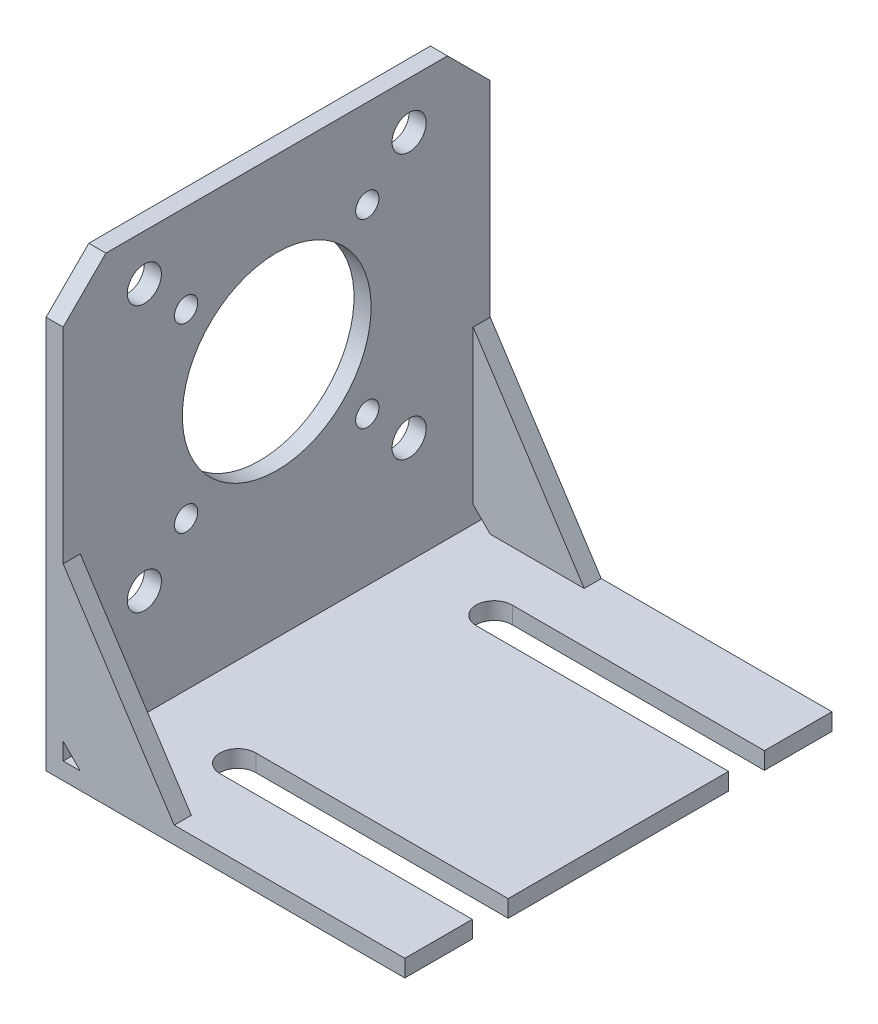
ISO-10303-21;
HEADER;
FILE_DESCRIPTION(('STEP AP214'),'2;1');
FILE_NAME('part.step','',(''),(''),'','','');
FILE_SCHEMA(('AUTOMOTIVE_DESIGN { 1 0 10303 214 1 1 1 1 }'));
ENDSEC;
DATA;
#1=APPLICATION_CONTEXT('core data for automotive mechanical design processes');
#2=APPLICATION_PROTOCOL_DEFINITION('international standard','automotive_design',2000,#1);
#3=PRODUCT_CONTEXT('',#1,'mechanical');
#4=PRODUCT('Part','Part','',(#3));
#5=PRODUCT_RELATED_PRODUCT_CATEGORY('part','',(#4));
#6=PRODUCT_DEFINITION_FORMATION('','',#4);
#7=PRODUCT_DEFINITION_CONTEXT('part definition',#1,'design');
#8=PRODUCT_DEFINITION('design','',#6,#7);
#9=PRODUCT_DEFINITION_SHAPE('','',#8);
#10=(LENGTH_UNIT() NAMED_UNIT(*) SI_UNIT(.MILLI.,.METRE.));
#11=(NAMED_UNIT(*) PLANE_ANGLE_UNIT() SI_UNIT($,.RADIAN.));
#12=(NAMED_UNIT(*) SI_UNIT($,.STERADIAN.) SOLID_ANGLE_UNIT());
#13=UNCERTAINTY_MEASURE_WITH_UNIT(LENGTH_MEASURE(1.E-05),#10,'distance_accuracy_value','');
#14=(GEOMETRIC_REPRESENTATION_CONTEXT(3) GLOBAL_UNCERTAINTY_ASSIGNED_CONTEXT((#13)) GLOBAL_UNIT_ASSIGNED_CONTEXT((#10,
#11,#12)) REPRESENTATION_CONTEXT('',''));
#15=CARTESIAN_POINT('',(0.,0.,0.));
#16=DIRECTION('',(0.,0.,1.));
#17=DIRECTION('',(1.,0.,0.));
#18=AXIS2_PLACEMENT_3D('',#15,#16,#17);
#19=CARTESIAN_POINT('',(53.,0.,50.));
#20=DIRECTION('',(0.,1.,0.));
#21=DIRECTION('',(-1.,0.,0.));
#22=AXIS2_PLACEMENT_3D('',#19,#20,#21);
#23=PLANE('',#22);
#24=DIRECTION('',(1.,0.,0.));
#25=VECTOR('',#24,1.);
#26=CARTESIAN_POINT('',(53.,0.,0.));
#27=LINE('',#26,#25);
#28=CARTESIAN_POINT('',(0.,0.,0.));
#29=VERTEX_POINT('',#28);
#30=CARTESIAN_POINT('',(42.,0.,0.));
#31=VERTEX_POINT('',#30);
#32=EDGE_CURVE('E235',#29,#31,#27,.T.);
#33=ORIENTED_EDGE('',*,*,#32,.T.);
#34=DIRECTION('',(0.,0.,1.));
#35=VECTOR('',#34,1.);
#36=CARTESIAN_POINT('',(42.,0.,50.));
#37=LINE('',#36,#35);
#38=CARTESIAN_POINT('',(42.,0.,7.90047683310867));
#39=VERTEX_POINT('',#38);
#40=EDGE_CURVE('E201',#31,#39,#37,.T.);
#41=ORIENTED_EDGE('',*,*,#40,.T.);
#42=DIRECTION('',(-1.,0.,0.));
#43=VECTOR('',#42,1.);
#44=CARTESIAN_POINT('',(53.,0.,7.90047683310866));
#45=LINE('',#44,#43);
#46=CARTESIAN_POINT('',(12.5,0.,7.90047683310867));
#47=VERTEX_POINT('',#46);
#48=EDGE_CURVE('E507',#39,#47,#45,.T.);
#49=ORIENTED_EDGE('',*,*,#48,.T.);
#50=CARTESIAN_POINT('',(12.4552510146861,0.,10.));
#51=DIRECTION('',(0.,1.,0.));
#52=DIRECTION('',(-1.,0.,0.));
#53=AXIS2_PLACEMENT_3D('',#50,#51,#52);
#54=CIRCLE('',#53,2.1);
#55=CARTESIAN_POINT('',(12.4552510146865,0.,12.1));
#56=VERTEX_POINT('',#55);
#57=EDGE_CURVE('E513',#47,#56,#54,.T.);
#58=ORIENTED_EDGE('',*,*,#57,.T.);
#59=DIRECTION('',(1.,0.,0.));
#60=VECTOR('',#59,1.);
#61=CARTESIAN_POINT('',(53.,0.,12.1));
#62=LINE('',#61,#60);
#63=CARTESIAN_POINT('',(42.,0.,12.1));
#64=VERTEX_POINT('',#63);
#65=EDGE_CURVE('E517',#56,#64,#62,.T.);
#66=ORIENTED_EDGE('',*,*,#65,.T.);
#67=CARTESIAN_POINT('',(42.,0.,37.9));
#68=VERTEX_POINT('',#67);
#69=EDGE_CURVE('E353',#64,#68,#37,.T.);
#70=ORIENTED_EDGE('',*,*,#69,.T.);
#71=DIRECTION('',(-1.,0.,0.));
#72=VECTOR('',#71,1.);
#73=CARTESIAN_POINT('',(53.,0.,37.9));
#74=LINE('',#73,#72);
#75=CARTESIAN_POINT('',(12.4552510146865,0.,37.9));
#76=VERTEX_POINT('',#75);
#77=EDGE_CURVE('E482',#68,#76,#74,.T.);
#78=ORIENTED_EDGE('',*,*,#77,.T.);
#79=CARTESIAN_POINT('',(12.4552510146873,0.,40.));
#80=DIRECTION('',(0.,1.,0.));
#81=DIRECTION('',(-1.,0.,0.));
#82=AXIS2_PLACEMENT_3D('',#79,#80,#81);
#83=CIRCLE('',#82,2.09999999999999);
#84=CARTESIAN_POINT('',(12.5,0.,42.0995231668913));
#85=VERTEX_POINT('',#84);
#86=EDGE_CURVE('E488',#76,#85,#83,.T.);
#87=ORIENTED_EDGE('',*,*,#86,.T.);
#88=DIRECTION('',(1.,0.,0.));
#89=VECTOR('',#88,1.);
#90=CARTESIAN_POINT('',(53.,0.,42.0995231668913));
#91=LINE('',#90,#89);
#92=CARTESIAN_POINT('',(42.,0.,42.0995231668913));
#93=VERTEX_POINT('',#92);
#94=EDGE_CURVE('E348',#85,#93,#91,.T.);
#95=ORIENTED_EDGE('',*,*,#94,.T.);
#96=CARTESIAN_POINT('',(42.,0.,50.));
#97=VERTEX_POINT('',#96);
#98=EDGE_CURVE('E62',#93,#97,#37,.T.);
#99=ORIENTED_EDGE('',*,*,#98,.T.);
#100=DIRECTION('',(1.,0.,0.));
#101=VECTOR('',#100,1.);
#102=CARTESIAN_POINT('',(53.,0.,50.));
#103=LINE('',#102,#101);
#104=CARTESIAN_POINT('',(0.,0.,50.));
#105=VERTEX_POINT('',#104);
#106=EDGE_CURVE('E243',#105,#97,#103,.T.);
#107=ORIENTED_EDGE('',*,*,#106,.F.);
#108=DIRECTION('',(0.,0.,-1.));
#109=VECTOR('',#108,1.);
#110=CARTESIAN_POINT('',(0.,0.,50.));
#111=LINE('',#110,#109);
#112=EDGE_CURVE('E244',#105,#29,#111,.T.);
#113=ORIENTED_EDGE('',*,*,#112,.T.);
#114=EDGE_LOOP('',(#33,#41,#49,#58,#66,#70,#78,#87,#95,#99,#107,#113));
#115=FACE_BOUND('',#114,.T.);
#116=ADVANCED_FACE('F38',(#115),#23,.F.);
#117=CARTESIAN_POINT('',(1.99999999999999,2.,50.));
#118=DIRECTION('',(0.,-1.,0.));
#119=DIRECTION('',(0.,0.,-1.));
#120=AXIS2_PLACEMENT_3D('',#117,#118,#119);
#121=PLANE('',#120);
#122=DIRECTION('',(-1.,0.,0.));
#123=VECTOR('',#122,1.);
#124=CARTESIAN_POINT('',(1.99999999999999,2.,50.));
#125=LINE('',#124,#123);
#126=CARTESIAN_POINT('',(42.,2.,50.));
#127=VERTEX_POINT('',#126);
#128=CARTESIAN_POINT('',(15.,2.,50.));
#129=VERTEX_POINT('',#128);
#130=EDGE_CURVE('E306',#127,#129,#125,.T.);
#131=ORIENTED_EDGE('',*,*,#130,.F.);
#132=DIRECTION('',(0.,0.,1.));
#133=VECTOR('',#132,1.);
#134=CARTESIAN_POINT('',(42.,2.,50.));
#135=LINE('',#134,#133);
#136=CARTESIAN_POINT('',(42.,2.,42.0995231668913));
#137=VERTEX_POINT('',#136);
#138=EDGE_CURVE('E220',#137,#127,#135,.T.);
#139=ORIENTED_EDGE('',*,*,#138,.F.);
#140=DIRECTION('',(1.,0.,0.));
#141=VECTOR('',#140,1.);
#142=CARTESIAN_POINT('',(12.5,2.,42.0995231668913));
#143=LINE('',#142,#141);
#144=CARTESIAN_POINT('',(12.5,2.,42.0995231668913));
#145=VERTEX_POINT('',#144);
#146=EDGE_CURVE('E474',#145,#137,#143,.T.);
#147=ORIENTED_EDGE('',*,*,#146,.F.);
#148=CARTESIAN_POINT('',(12.4552510146873,2.,40.));
#149=DIRECTION('',(0.,1.,0.));
#150=DIRECTION('',(0.,0.,-1.));
#151=AXIS2_PLACEMENT_3D('',#148,#149,#150);
#152=CIRCLE('',#151,2.09999999999999);
#153=CARTESIAN_POINT('',(12.4552510146865,2.,37.9));
#154=VERTEX_POINT('',#153);
#155=EDGE_CURVE('E470',#154,#145,#152,.T.);
#156=ORIENTED_EDGE('',*,*,#155,.F.);
#157=DIRECTION('',(-1.,0.,0.));
#158=VECTOR('',#157,1.);
#159=CARTESIAN_POINT('',(12.4552510146865,2.,37.9));
#160=LINE('',#159,#158);
#161=CARTESIAN_POINT('',(42.,2.,37.9));
#162=VERTEX_POINT('',#161);
#163=EDGE_CURVE('E457',#162,#154,#160,.T.);
#164=ORIENTED_EDGE('',*,*,#163,.F.);
#165=CARTESIAN_POINT('',(42.,2.,12.1));
#166=VERTEX_POINT('',#165);
#167=EDGE_CURVE('E218',#166,#162,#135,.T.);
#168=ORIENTED_EDGE('',*,*,#167,.F.);
#169=DIRECTION('',(1.,0.,0.));
#170=VECTOR('',#169,1.);
#171=CARTESIAN_POINT('',(12.4552510146865,2.,12.1));
#172=LINE('',#171,#170);
#173=CARTESIAN_POINT('',(12.4552510146865,2.,12.1));
#174=VERTEX_POINT('',#173);
#175=EDGE_CURVE('E499',#174,#166,#172,.T.);
#176=ORIENTED_EDGE('',*,*,#175,.F.);
#177=CARTESIAN_POINT('',(12.4552510146861,2.,10.));
#178=DIRECTION('',(0.,1.,0.));
#179=DIRECTION('',(0.,0.,-1.));
#180=AXIS2_PLACEMENT_3D('',#177,#178,#179);
#181=CIRCLE('',#180,2.1);
#182=CARTESIAN_POINT('',(12.5,2.,7.90047683310867));
#183=VERTEX_POINT('',#182);
#184=EDGE_CURVE('E495',#183,#174,#181,.T.);
#185=ORIENTED_EDGE('',*,*,#184,.F.);
#186=DIRECTION('',(-1.,0.,0.));
#187=VECTOR('',#186,1.);
#188=CARTESIAN_POINT('',(12.5,2.,7.90047683310867));
#189=LINE('',#188,#187);
#190=CARTESIAN_POINT('',(42.,2.,7.90047683310867));
#191=VERTEX_POINT('',#190);
#192=EDGE_CURVE('E216',#191,#183,#189,.T.);
#193=ORIENTED_EDGE('',*,*,#192,.F.);
#194=CARTESIAN_POINT('',(42.,2.,0.));
#195=VERTEX_POINT('',#194);
#196=EDGE_CURVE('E54',#195,#191,#135,.T.);
#197=ORIENTED_EDGE('',*,*,#196,.F.);
#198=DIRECTION('',(-1.,0.,0.));
#199=VECTOR('',#198,1.);
#200=CARTESIAN_POINT('',(1.99999999999999,2.,0.));
#201=LINE('',#200,#199);
#202=CARTESIAN_POINT('',(15.,2.,0.));
#203=VERTEX_POINT('',#202);
#204=EDGE_CURVE('E213',#195,#203,#201,.T.);
#205=ORIENTED_EDGE('',*,*,#204,.T.);
#206=DIRECTION('',(0.,0.,-1.));
#207=VECTOR('',#206,1.);
#208=CARTESIAN_POINT('',(15.,2.,2.));
#209=LINE('',#208,#207);
#210=CARTESIAN_POINT('',(15.,2.,2.));
#211=VERTEX_POINT('',#210);
#212=EDGE_CURVE('E418',#211,#203,#209,.T.);
#213=ORIENTED_EDGE('',*,*,#212,.F.);
#214=DIRECTION('',(-1.,0.,0.));
#215=VECTOR('',#214,1.);
#216=CARTESIAN_POINT('',(15.,2.,2.));
#217=LINE('',#216,#215);
#218=CARTESIAN_POINT('',(3.99999999999999,2.,2.));
#219=VERTEX_POINT('',#218);
#220=EDGE_CURVE('E398',#211,#219,#217,.T.);
#221=ORIENTED_EDGE('',*,*,#220,.T.);
#222=DIRECTION('',(0.,0.,-1.));
#223=VECTOR('',#222,1.);
#224=CARTESIAN_POINT('',(3.99999999999999,2.,2.));
#225=LINE('',#224,#223);
#226=CARTESIAN_POINT('',(3.99999999999999,2.,0.));
#227=VERTEX_POINT('',#226);
#228=EDGE_CURVE('E412',#219,#227,#225,.T.);
#229=ORIENTED_EDGE('',*,*,#228,.T.);
#230=CARTESIAN_POINT('',(1.99999999999999,2.,0.));
#231=VERTEX_POINT('',#230);
#232=EDGE_CURVE('E228',#227,#231,#201,.T.);
#233=ORIENTED_EDGE('',*,*,#232,.T.);
#234=DIRECTION('',(0.,0.,-1.));
#235=VECTOR('',#234,1.);
#236=CARTESIAN_POINT('',(1.99999999999999,2.,50.));
#237=LINE('',#236,#235);
#238=CARTESIAN_POINT('',(1.99999999999999,2.,50.));
#239=VERTEX_POINT('',#238);
#240=EDGE_CURVE('E257',#239,#231,#237,.T.);
#241=ORIENTED_EDGE('',*,*,#240,.F.);
#242=CARTESIAN_POINT('',(3.99999999999999,2.,50.));
#243=VERTEX_POINT('',#242);
#244=EDGE_CURVE('E339',#243,#239,#125,.T.);
#245=ORIENTED_EDGE('',*,*,#244,.F.);
#246=DIRECTION('',(0.,0.,1.));
#247=VECTOR('',#246,1.);
#248=CARTESIAN_POINT('',(3.99999999999999,2.,48.));
#249=LINE('',#248,#247);
#250=CARTESIAN_POINT('',(3.99999999999999,2.,48.));
#251=VERTEX_POINT('',#250);
#252=EDGE_CURVE('E458',#251,#243,#249,.T.);
#253=ORIENTED_EDGE('',*,*,#252,.F.);
#254=DIRECTION('',(1.,0.,0.));
#255=VECTOR('',#254,1.);
#256=CARTESIAN_POINT('',(3.99999999999999,2.,48.));
#257=LINE('',#256,#255);
#258=CARTESIAN_POINT('',(15.,2.,48.));
#259=VERTEX_POINT('',#258);
#260=EDGE_CURVE('E444',#251,#259,#257,.T.);
#261=ORIENTED_EDGE('',*,*,#260,.T.);
#262=DIRECTION('',(0.,0.,1.));
#263=VECTOR('',#262,1.);
#264=CARTESIAN_POINT('',(15.,2.,48.));
#265=LINE('',#264,#263);
#266=EDGE_CURVE('E453',#259,#129,#265,.T.);
#267=ORIENTED_EDGE('',*,*,#266,.T.);
#268=EDGE_LOOP('',(#131,#139,#147,#156,#164,#168,#176,#185,#193,#197,#205,#213,#221,#229,#233,
#241,#245,#253,#261,#267));
#269=FACE_BOUND('',#268,.T.);
#270=ADVANCED_FACE('F212',(#269),#121,.F.);
#271=CARTESIAN_POINT('',(1.99999999999999,51.,50.));
#272=DIRECTION('',(-1.,0.,0.));
#273=DIRECTION('',(0.,-1.,0.));
#274=AXIS2_PLACEMENT_3D('',#271,#272,#273);
#275=PLANE('',#274);
#276=CARTESIAN_POINT('',(1.99999999999999,40.6066017177981,35.6066017177983));
#277=DIRECTION('',(-1.,0.,0.));
#278=DIRECTION('',(0.,-1.,0.));
#279=AXIS2_PLACEMENT_3D('',#276,#277,#278);
#280=CIRCLE('',#279,1.36115340044237);
#281=CARTESIAN_POINT('',(1.99999999999999,39.2454483173557,35.6066017177983));
#282=VERTEX_POINT('',#281);
#283=EDGE_CURVE('E393',#282,#282,#280,.T.);
#284=ORIENTED_EDGE('',*,*,#283,.T.);
#285=EDGE_LOOP('',(#284));
#286=FACE_BOUND('',#285,.T.);
#287=CARTESIAN_POINT('',(1.99999999999999,40.6066017177983,14.3933982822019));
#288=DIRECTION('',(-1.,0.,0.));
#289=DIRECTION('',(0.,-1.,0.));
#290=AXIS2_PLACEMENT_3D('',#287,#288,#289);
#291=CIRCLE('',#290,1.36115340044236);
#292=CARTESIAN_POINT('',(1.99999999999999,39.2454483173559,14.3933982822019));
#293=VERTEX_POINT('',#292);
#294=EDGE_CURVE('E389',#293,#293,#291,.T.);
#295=ORIENTED_EDGE('',*,*,#294,.T.);
#296=EDGE_LOOP('',(#295));
#297=FACE_BOUND('',#296,.T.);
#298=CARTESIAN_POINT('',(1.99999999999999,19.3933982822018,14.3933982822017));
#299=DIRECTION('',(-1.,0.,0.));
#300=DIRECTION('',(0.,-1.,0.));
#301=AXIS2_PLACEMENT_3D('',#298,#299,#300);
#302=CIRCLE('',#301,1.36115340044237);
#303=CARTESIAN_POINT('',(1.99999999999999,18.0322448817595,14.3933982822017));
#304=VERTEX_POINT('',#303);
#305=EDGE_CURVE('E385',#304,#304,#302,.T.);
#306=ORIENTED_EDGE('',*,*,#305,.T.);
#307=EDGE_LOOP('',(#306));
#308=FACE_BOUND('',#307,.T.);
#309=CARTESIAN_POINT('',(1.99999999999999,19.3933982822018,35.6066017177982));
#310=DIRECTION('',(-1.,0.,0.));
#311=DIRECTION('',(0.,-1.,0.));
#312=AXIS2_PLACEMENT_3D('',#309,#310,#311);
#313=CIRCLE('',#312,1.36115340044237);
#314=CARTESIAN_POINT('',(1.99999999999999,18.0322448817594,35.6066017177982));
#315=VERTEX_POINT('',#314);
#316=EDGE_CURVE('E381',#315,#315,#313,.T.);
#317=ORIENTED_EDGE('',*,*,#316,.T.);
#318=EDGE_LOOP('',(#317));
#319=FACE_BOUND('',#318,.T.);
#320=DIRECTION('',(0.,0.,-1.));
#321=VECTOR('',#320,1.);
#322=CARTESIAN_POINT('',(1.99999999999999,51.,50.));
#323=LINE('',#322,#321);
#324=CARTESIAN_POINT('',(1.99999999999999,51.,45.));
#325=VERTEX_POINT('',#324);
#326=CARTESIAN_POINT('',(1.99999999999999,51.,4.99999999999999));
#327=VERTEX_POINT('',#326);
#328=EDGE_CURVE('E253',#325,#327,#323,.T.);
#329=ORIENTED_EDGE('',*,*,#328,.F.);
#330=DIRECTION('',(0.,0.707106781186547,-0.707106781186549));
#331=VECTOR('',#330,1.);
#332=CARTESIAN_POINT('',(1.99999999999999,46.,50.));
#333=LINE('',#332,#331);
#334=CARTESIAN_POINT('',(1.99999999999999,46.,50.));
#335=VERTEX_POINT('',#334);
#336=EDGE_CURVE('E47',#325,#335,#333,.F.);
#337=ORIENTED_EDGE('',*,*,#336,.T.);
#338=DIRECTION('',(0.,1.,0.));
#339=VECTOR('',#338,1.);
#340=CARTESIAN_POINT('',(1.99999999999999,51.,50.));
#341=LINE('',#340,#339);
#342=CARTESIAN_POINT('',(1.99999999999999,22.,50.));
#343=VERTEX_POINT('',#342);
#344=EDGE_CURVE('E292',#343,#335,#341,.T.);
#345=ORIENTED_EDGE('',*,*,#344,.F.);
#346=DIRECTION('',(0.,0.,1.));
#347=VECTOR('',#346,1.);
#348=CARTESIAN_POINT('',(1.99999999999999,22.,48.));
#349=LINE('',#348,#347);
#350=CARTESIAN_POINT('',(1.99999999999999,22.,48.));
#351=VERTEX_POINT('',#350);
#352=EDGE_CURVE('E448',#351,#343,#349,.T.);
#353=ORIENTED_EDGE('',*,*,#352,.F.);
#354=DIRECTION('',(0.,-1.,0.));
#355=VECTOR('',#354,1.);
#356=CARTESIAN_POINT('',(1.99999999999999,22.,48.));
#357=LINE('',#356,#355);
#358=CARTESIAN_POINT('',(2.,4.,48.));
#359=VERTEX_POINT('',#358);
#360=EDGE_CURVE('E436',#351,#359,#357,.T.);
#361=ORIENTED_EDGE('',*,*,#360,.T.);
#362=DIRECTION('',(0.,0.,1.));
#363=VECTOR('',#362,1.);
#364=CARTESIAN_POINT('',(2.,4.,48.));
#365=LINE('',#364,#363);
#366=CARTESIAN_POINT('',(2.,4.,50.));
#367=VERTEX_POINT('',#366);
#368=EDGE_CURVE('E462',#359,#367,#365,.T.);
#369=ORIENTED_EDGE('',*,*,#368,.T.);
#370=EDGE_CURVE('E305',#239,#367,#341,.T.);
#371=ORIENTED_EDGE('',*,*,#370,.F.);
#372=ORIENTED_EDGE('',*,*,#240,.T.);
#373=DIRECTION('',(0.,1.,0.));
#374=VECTOR('',#373,1.);
#375=CARTESIAN_POINT('',(1.99999999999999,51.,0.));
#376=LINE('',#375,#374);
#377=CARTESIAN_POINT('',(1.99999999999999,4.00000000000001,0.));
#378=VERTEX_POINT('',#377);
#379=EDGE_CURVE('E233',#231,#378,#376,.T.);
#380=ORIENTED_EDGE('',*,*,#379,.T.);
#381=DIRECTION('',(0.,0.,-1.));
#382=VECTOR('',#381,1.);
#383=CARTESIAN_POINT('',(1.99999999999999,4.,2.));
#384=LINE('',#383,#382);
#385=CARTESIAN_POINT('',(1.99999999999999,4.,2.));
#386=VERTEX_POINT('',#385);
#387=EDGE_CURVE('E425',#386,#378,#384,.T.);
#388=ORIENTED_EDGE('',*,*,#387,.F.);
#389=DIRECTION('',(0.,1.,0.));
#390=VECTOR('',#389,1.);
#391=CARTESIAN_POINT('',(1.99999999999999,4.,2.));
#392=LINE('',#391,#390);
#393=CARTESIAN_POINT('',(1.99999999999999,22.,2.));
#394=VERTEX_POINT('',#393);
#395=EDGE_CURVE('E405',#386,#394,#392,.T.);
#396=ORIENTED_EDGE('',*,*,#395,.T.);
#397=DIRECTION('',(0.,0.,-1.));
#398=VECTOR('',#397,1.);
#399=CARTESIAN_POINT('',(1.99999999999999,22.,2.));
#400=LINE('',#399,#398);
#401=CARTESIAN_POINT('',(1.99999999999999,22.,0.));
#402=VERTEX_POINT('',#401);
#403=EDGE_CURVE('E421',#394,#402,#400,.T.);
#404=ORIENTED_EDGE('',*,*,#403,.T.);
#405=CARTESIAN_POINT('',(1.99999999999999,46.,0.));
#406=VERTEX_POINT('',#405);
#407=EDGE_CURVE('E227',#402,#406,#376,.T.);
#408=ORIENTED_EDGE('',*,*,#407,.T.);
#409=DIRECTION('',(0.,0.707106781186549,0.707106781186547));
#410=VECTOR('',#409,1.);
#411=CARTESIAN_POINT('',(1.99999999999999,51.,4.99999999999999));
#412=LINE('',#411,#410);
#413=EDGE_CURVE('E281',#406,#327,#412,.T.);
#414=ORIENTED_EDGE('',*,*,#413,.T.);
#415=EDGE_LOOP('',(#329,#337,#345,#353,#361,#369,#371,#372,#380,#388,#396,#404,#408,#414));
#416=FACE_BOUND('',#415,.T.);
#417=CARTESIAN_POINT('',(1.99999999999999,45.6404459869094,40.5));
#418=DIRECTION('',(1.,0.,0.));
#419=DIRECTION('',(0.,1.,0.));
#420=AXIS2_PLACEMENT_3D('',#417,#418,#419);
#421=CIRCLE('',#420,2.);
#422=CARTESIAN_POINT('',(1.99999999999999,47.6404459869094,40.5));
#423=VERTEX_POINT('',#422);
#424=EDGE_CURVE('E524',#423,#423,#421,.T.);
#425=ORIENTED_EDGE('',*,*,#424,.F.);
#426=EDGE_LOOP('',(#425));
#427=FACE_BOUND('',#426,.T.);
#428=CARTESIAN_POINT('',(1.99999999999999,45.5,9.50000000000001));
#429=DIRECTION('',(1.,0.,0.));
#430=DIRECTION('',(0.,1.,0.));
#431=AXIS2_PLACEMENT_3D('',#428,#429,#430);
#432=CIRCLE('',#431,2.);
#433=CARTESIAN_POINT('',(1.99999999999999,47.5,9.50000000000001));
#434=VERTEX_POINT('',#433);
#435=EDGE_CURVE('E532',#434,#434,#432,.T.);
#436=ORIENTED_EDGE('',*,*,#435,.F.);
#437=EDGE_LOOP('',(#436));
#438=FACE_BOUND('',#437,.T.);
#439=CARTESIAN_POINT('',(1.99999999999999,14.5,40.5));
#440=DIRECTION('',(1.,0.,0.));
#441=DIRECTION('',(0.,1.,0.));
#442=AXIS2_PLACEMENT_3D('',#439,#440,#441);
#443=CIRCLE('',#442,2.);
#444=CARTESIAN_POINT('',(1.99999999999999,16.5,40.5));
#445=VERTEX_POINT('',#444);
#446=EDGE_CURVE('E540',#445,#445,#443,.T.);
#447=ORIENTED_EDGE('',*,*,#446,.F.);
#448=EDGE_LOOP('',(#447));
#449=FACE_BOUND('',#448,.T.);
#450=CARTESIAN_POINT('',(1.99999999999999,14.5,9.5));
#451=DIRECTION('',(1.,0.,0.));
#452=DIRECTION('',(0.,1.,0.));
#453=AXIS2_PLACEMENT_3D('',#450,#451,#452);
#454=CIRCLE('',#453,2.);
#455=CARTESIAN_POINT('',(1.99999999999999,16.5,9.5));
#456=VERTEX_POINT('',#455);
#457=EDGE_CURVE('E334',#456,#456,#454,.T.);
#458=ORIENTED_EDGE('',*,*,#457,.F.);
#459=EDGE_LOOP('',(#458));
#460=FACE_BOUND('',#459,.T.);
#461=CARTESIAN_POINT('',(1.99999999999999,30.,25.));
#462=DIRECTION('',(1.,0.,0.));
#463=DIRECTION('',(0.,1.,0.));
#464=AXIS2_PLACEMENT_3D('',#461,#462,#463);
#465=CIRCLE('',#464,11.05);
#466=CARTESIAN_POINT('',(1.99999999999999,41.05,25.));
#467=VERTEX_POINT('',#466);
#468=EDGE_CURVE('E325',#467,#467,#465,.T.);
#469=ORIENTED_EDGE('',*,*,#468,.F.);
#470=EDGE_LOOP('',(#469));
#471=FACE_BOUND('',#470,.T.);
#472=ADVANCED_FACE('F289',(#286,#297,#308,#319,#416,#427,#438,#449,#460,#471),#275,.F.);
#473=CARTESIAN_POINT('',(0.,51.,50.));
#474=DIRECTION('',(0.,-1.,0.));
#475=DIRECTION('',(0.,0.,-1.));
#476=AXIS2_PLACEMENT_3D('',#473,#474,#475);
#477=PLANE('',#476);
#478=DIRECTION('',(0.,0.,-1.));
#479=VECTOR('',#478,1.);
#480=CARTESIAN_POINT('',(0.,51.,50.));
#481=LINE('',#480,#479);
#482=CARTESIAN_POINT('',(0.,51.,45.));
#483=VERTEX_POINT('',#482);
#484=CARTESIAN_POINT('',(0.,51.,4.99999999999999));
#485=VERTEX_POINT('',#484);
#486=EDGE_CURVE('E248',#483,#485,#481,.T.);
#487=ORIENTED_EDGE('',*,*,#486,.F.);
#488=DIRECTION('',(1.,0.,0.));
#489=VECTOR('',#488,1.);
#490=CARTESIAN_POINT('',(0.,51.,45.));
#491=LINE('',#490,#489);
#492=EDGE_CURVE('E278',#483,#325,#491,.T.);
#493=ORIENTED_EDGE('',*,*,#492,.T.);
#494=ORIENTED_EDGE('',*,*,#328,.T.);
#495=DIRECTION('',(-1.,0.,0.));
#496=VECTOR('',#495,1.);
#497=CARTESIAN_POINT('',(0.,51.,4.99999999999999));
#498=LINE('',#497,#496);
#499=EDGE_CURVE('E274',#327,#485,#498,.T.);
#500=ORIENTED_EDGE('',*,*,#499,.T.);
#501=EDGE_LOOP('',(#487,#493,#494,#500));
#502=FACE_BOUND('',#501,.T.);
#503=ADVANCED_FACE('F314',(#502),#477,.F.);
#504=CARTESIAN_POINT('',(0.,0.,50.));
#505=DIRECTION('',(1.,0.,0.));
#506=DIRECTION('',(0.,1.,0.));
#507=AXIS2_PLACEMENT_3D('',#504,#505,#506);
#508=PLANE('',#507);
#509=CARTESIAN_POINT('',(0.,40.6066017177981,35.6066017177983));
#510=DIRECTION('',(-1.,0.,0.));
#511=DIRECTION('',(0.,-1.,0.));
#512=AXIS2_PLACEMENT_3D('',#509,#510,#511);
#513=CIRCLE('',#512,1.36115340044237);
#514=CARTESIAN_POINT('',(0.,39.2454483173557,35.6066017177983));
#515=VERTEX_POINT('',#514);
#516=EDGE_CURVE('E363',#515,#515,#513,.T.);
#517=ORIENTED_EDGE('',*,*,#516,.F.);
#518=EDGE_LOOP('',(#517));
#519=FACE_BOUND('',#518,.T.);
#520=CARTESIAN_POINT('',(0.,40.6066017177983,14.3933982822019));
#521=DIRECTION('',(-1.,0.,0.));
#522=DIRECTION('',(0.,-1.,0.));
#523=AXIS2_PLACEMENT_3D('',#520,#521,#522);
#524=CIRCLE('',#523,1.36115340044236);
#525=CARTESIAN_POINT('',(0.,39.2454483173559,14.3933982822019));
#526=VERTEX_POINT('',#525);
#527=EDGE_CURVE('E367',#526,#526,#524,.T.);
#528=ORIENTED_EDGE('',*,*,#527,.F.);
#529=EDGE_LOOP('',(#528));
#530=FACE_BOUND('',#529,.T.);
#531=CARTESIAN_POINT('',(0.,19.3933982822018,14.3933982822017));
#532=DIRECTION('',(-1.,0.,0.));
#533=DIRECTION('',(0.,-1.,0.));
#534=AXIS2_PLACEMENT_3D('',#531,#532,#533);
#535=CIRCLE('',#534,1.36115340044237);
#536=CARTESIAN_POINT('',(0.,18.0322448817595,14.3933982822017));
#537=VERTEX_POINT('',#536);
#538=EDGE_CURVE('E373',#537,#537,#535,.T.);
#539=ORIENTED_EDGE('',*,*,#538,.F.);
#540=EDGE_LOOP('',(#539));
#541=FACE_BOUND('',#540,.T.);
#542=CARTESIAN_POINT('',(0.,19.3933982822018,35.6066017177982));
#543=DIRECTION('',(-1.,0.,0.));
#544=DIRECTION('',(0.,-1.,0.));
#545=AXIS2_PLACEMENT_3D('',#542,#543,#544);
#546=CIRCLE('',#545,1.36115340044237);
#547=CARTESIAN_POINT('',(0.,18.0322448817594,35.6066017177982));
#548=VERTEX_POINT('',#547);
#549=EDGE_CURVE('E377',#548,#548,#546,.T.);
#550=ORIENTED_EDGE('',*,*,#549,.F.);
#551=EDGE_LOOP('',(#550));
#552=FACE_BOUND('',#551,.T.);
#553=CARTESIAN_POINT('',(0.,45.6404459869094,40.5));
#554=DIRECTION('',(1.,0.,0.));
#555=DIRECTION('',(0.,1.,0.));
#556=AXIS2_PLACEMENT_3D('',#553,#554,#555);
#557=CIRCLE('',#556,2.);
#558=CARTESIAN_POINT('',(0.,47.6404459869094,40.5));
#559=VERTEX_POINT('',#558);
#560=EDGE_CURVE('E331',#559,#559,#557,.T.);
#561=ORIENTED_EDGE('',*,*,#560,.T.);
#562=EDGE_LOOP('',(#561));
#563=FACE_BOUND('',#562,.T.);
#564=CARTESIAN_POINT('',(0.,45.5,9.50000000000001));
#565=DIRECTION('',(1.,0.,0.));
#566=DIRECTION('',(0.,1.,0.));
#567=AXIS2_PLACEMENT_3D('',#564,#565,#566);
#568=CIRCLE('',#567,2.);
#569=CARTESIAN_POINT('',(0.,47.5,9.50000000000001));
#570=VERTEX_POINT('',#569);
#571=EDGE_CURVE('E528',#570,#570,#568,.T.);
#572=ORIENTED_EDGE('',*,*,#571,.T.);
#573=EDGE_LOOP('',(#572));
#574=FACE_BOUND('',#573,.T.);
#575=CARTESIAN_POINT('',(0.,14.5,40.5));
#576=DIRECTION('',(1.,0.,0.));
#577=DIRECTION('',(0.,1.,0.));
#578=AXIS2_PLACEMENT_3D('',#575,#576,#577);
#579=CIRCLE('',#578,2.);
#580=CARTESIAN_POINT('',(0.,16.5,40.5));
#581=VERTEX_POINT('',#580);
#582=EDGE_CURVE('E536',#581,#581,#579,.T.);
#583=ORIENTED_EDGE('',*,*,#582,.T.);
#584=EDGE_LOOP('',(#583));
#585=FACE_BOUND('',#584,.T.);
#586=CARTESIAN_POINT('',(0.,14.5,9.5));
#587=DIRECTION('',(1.,0.,0.));
#588=DIRECTION('',(0.,1.,0.));
#589=AXIS2_PLACEMENT_3D('',#586,#587,#588);
#590=CIRCLE('',#589,2.);
#591=CARTESIAN_POINT('',(0.,16.5,9.5));
#592=VERTEX_POINT('',#591);
#593=EDGE_CURVE('E543',#592,#592,#590,.T.);
#594=ORIENTED_EDGE('',*,*,#593,.T.);
#595=EDGE_LOOP('',(#594));
#596=FACE_BOUND('',#595,.T.);
#597=CARTESIAN_POINT('',(0.,30.,25.));
#598=DIRECTION('',(1.,0.,0.));
#599=DIRECTION('',(0.,1.,0.));
#600=AXIS2_PLACEMENT_3D('',#597,#598,#599);
#601=CIRCLE('',#600,11.05);
#602=CARTESIAN_POINT('',(0.,41.05,25.));
#603=VERTEX_POINT('',#602);
#604=EDGE_CURVE('E322',#603,#603,#601,.T.);
#605=ORIENTED_EDGE('',*,*,#604,.T.);
#606=EDGE_LOOP('',(#605));
#607=FACE_BOUND('',#606,.T.);
#608=DIRECTION('',(0.,-1.,0.));
#609=VECTOR('',#608,1.);
#610=CARTESIAN_POINT('',(0.,0.,50.));
#611=LINE('',#610,#609);
#612=CARTESIAN_POINT('',(0.,46.,50.));
#613=VERTEX_POINT('',#612);
#614=EDGE_CURVE('E249',#613,#105,#611,.T.);
#615=ORIENTED_EDGE('',*,*,#614,.F.);
#616=DIRECTION('',(0.,-0.707106781186547,0.707106781186549));
#617=VECTOR('',#616,1.);
#618=CARTESIAN_POINT('',(0.,46.,50.));
#619=LINE('',#618,#617);
#620=EDGE_CURVE('E271',#613,#483,#619,.F.);
#621=ORIENTED_EDGE('',*,*,#620,.T.);
#622=ORIENTED_EDGE('',*,*,#486,.T.);
#623=DIRECTION('',(0.,-0.707106781186549,-0.707106781186547));
#624=VECTOR('',#623,1.);
#625=CARTESIAN_POINT('',(0.,51.,4.99999999999999));
#626=LINE('',#625,#624);
#627=CARTESIAN_POINT('',(0.,46.,0.));
#628=VERTEX_POINT('',#627);
#629=EDGE_CURVE('E268',#485,#628,#626,.T.);
#630=ORIENTED_EDGE('',*,*,#629,.T.);
#631=DIRECTION('',(0.,-1.,0.));
#632=VECTOR('',#631,1.);
#633=CARTESIAN_POINT('',(0.,0.,0.));
#634=LINE('',#633,#632);
#635=EDGE_CURVE('E240',#628,#29,#634,.T.);
#636=ORIENTED_EDGE('',*,*,#635,.T.);
#637=ORIENTED_EDGE('',*,*,#112,.F.);
#638=EDGE_LOOP('',(#615,#621,#622,#630,#636,#637));
#639=FACE_BOUND('',#638,.T.);
#640=ADVANCED_FACE('F311',(#519,#530,#541,#552,#563,#574,#585,#596,#607,#639),#508,.F.);
#641=CARTESIAN_POINT('',(0.,0.,50.));
#642=DIRECTION('',(0.,0.,-1.));
#643=DIRECTION('',(-1.,0.,0.));
#644=AXIS2_PLACEMENT_3D('',#641,#642,#643);
#645=PLANE('',#644);
#646=ORIENTED_EDGE('',*,*,#106,.T.);
#647=DIRECTION('',(0.,1.,0.));
#648=VECTOR('',#647,1.);
#649=CARTESIAN_POINT('',(42.,-8.,50.));
#650=LINE('',#649,#648);
#651=EDGE_CURVE('E207',#97,#127,#650,.T.);
#652=ORIENTED_EDGE('',*,*,#651,.T.);
#653=ORIENTED_EDGE('',*,*,#130,.T.);
#654=DIRECTION('',(-0.544988350595414,0.838443616300637,0.));
#655=VECTOR('',#654,1.);
#656=CARTESIAN_POINT('',(15.,2.,50.));
#657=LINE('',#656,#655);
#658=EDGE_CURVE('E302',#129,#343,#657,.T.);
#659=ORIENTED_EDGE('',*,*,#658,.T.);
#660=ORIENTED_EDGE('',*,*,#344,.T.);
#661=DIRECTION('',(-1.,0.,0.));
#662=VECTOR('',#661,1.);
#663=CARTESIAN_POINT('',(0.,46.,50.));
#664=LINE('',#663,#662);
#665=EDGE_CURVE('E261',#335,#613,#664,.T.);
#666=ORIENTED_EDGE('',*,*,#665,.T.);
#667=ORIENTED_EDGE('',*,*,#614,.T.);
#668=EDGE_LOOP('',(#646,#652,#653,#659,#660,#666,#667));
#669=FACE_BOUND('',#668,.T.);
#670=DIRECTION('',(0.707106781186547,-0.707106781186548,0.));
#671=VECTOR('',#670,1.);
#672=CARTESIAN_POINT('',(2.,4.,50.));
#673=LINE('',#672,#671);
#674=EDGE_CURVE('E437',#367,#243,#673,.T.);
#675=ORIENTED_EDGE('',*,*,#674,.T.);
#676=ORIENTED_EDGE('',*,*,#244,.T.);
#677=ORIENTED_EDGE('',*,*,#370,.T.);
#678=EDGE_LOOP('',(#675,#676,#677));
#679=FACE_BOUND('',#678,.T.);
#680=ADVANCED_FACE('F298',(#669,#679),#645,.F.);
#681=CARTESIAN_POINT('',(0.,0.,0.));
#682=DIRECTION('',(0.,0.,-1.));
#683=DIRECTION('',(-1.,0.,0.));
#684=AXIS2_PLACEMENT_3D('',#681,#682,#683);
#685=PLANE('',#684);
#686=DIRECTION('',(0.,1.,0.));
#687=VECTOR('',#686,1.);
#688=CARTESIAN_POINT('',(42.,-8.,0.));
#689=LINE('',#688,#687);
#690=EDGE_CURVE('E198',#31,#195,#689,.T.);
#691=ORIENTED_EDGE('',*,*,#690,.F.);
#692=ORIENTED_EDGE('',*,*,#32,.F.);
#693=ORIENTED_EDGE('',*,*,#635,.F.);
#694=DIRECTION('',(1.,0.,0.));
#695=VECTOR('',#694,1.);
#696=CARTESIAN_POINT('',(1.99999999999999,46.,0.));
#697=LINE('',#696,#695);
#698=EDGE_CURVE('E265',#628,#406,#697,.T.);
#699=ORIENTED_EDGE('',*,*,#698,.T.);
#700=ORIENTED_EDGE('',*,*,#407,.F.);
#701=DIRECTION('',(0.544988350595414,-0.838443616300637,0.));
#702=VECTOR('',#701,1.);
#703=CARTESIAN_POINT('',(1.99999999999999,22.,0.));
#704=LINE('',#703,#702);
#705=EDGE_CURVE('E225',#402,#203,#704,.T.);
#706=ORIENTED_EDGE('',*,*,#705,.T.);
#707=ORIENTED_EDGE('',*,*,#204,.F.);
#708=EDGE_LOOP('',(#691,#692,#693,#699,#700,#706,#707));
#709=FACE_BOUND('',#708,.T.);
#710=ORIENTED_EDGE('',*,*,#232,.F.);
#711=DIRECTION('',(-0.707106781186548,0.707106781186547,0.));
#712=VECTOR('',#711,1.);
#713=CARTESIAN_POINT('',(3.99999999999999,2.,0.));
#714=LINE('',#713,#712);
#715=EDGE_CURVE('E397',#227,#378,#714,.T.);
#716=ORIENTED_EDGE('',*,*,#715,.T.);
#717=ORIENTED_EDGE('',*,*,#379,.F.);
#718=EDGE_LOOP('',(#710,#716,#717));
#719=FACE_BOUND('',#718,.T.);
#720=ADVANCED_FACE('F222',(#709,#719),#685,.T.);
#721=CARTESIAN_POINT('',(0.,30.,25.));
#722=DIRECTION('',(1.,0.,0.));
#723=DIRECTION('',(0.,1.,0.));
#724=AXIS2_PLACEMENT_3D('',#721,#722,#723);
#725=CYLINDRICAL_SURFACE('',#724,11.05);
#726=ORIENTED_EDGE('',*,*,#604,.F.);
#727=EDGE_LOOP('',(#726));
#728=FACE_BOUND('',#727,.T.);
#729=ORIENTED_EDGE('',*,*,#468,.T.);
#730=EDGE_LOOP('',(#729));
#731=FACE_BOUND('',#730,.T.);
#732=ADVANCED_FACE('F560',(#728,#731),#725,.F.);
#733=CARTESIAN_POINT('',(0.,14.5,9.5));
#734=DIRECTION('',(1.,0.,0.));
#735=DIRECTION('',(0.,1.,0.));
#736=AXIS2_PLACEMENT_3D('',#733,#734,#735);
#737=CYLINDRICAL_SURFACE('',#736,2.);
#738=ORIENTED_EDGE('',*,*,#593,.F.);
#739=EDGE_LOOP('',(#738));
#740=FACE_BOUND('',#739,.T.);
#741=ORIENTED_EDGE('',*,*,#457,.T.);
#742=EDGE_LOOP('',(#741));
#743=FACE_BOUND('',#742,.T.);
#744=ADVANCED_FACE('F552',(#740,#743),#737,.F.);
#745=CARTESIAN_POINT('',(0.,14.5,40.5));
#746=DIRECTION('',(1.,0.,0.));
#747=DIRECTION('',(0.,1.,0.));
#748=AXIS2_PLACEMENT_3D('',#745,#746,#747);
#749=CYLINDRICAL_SURFACE('',#748,2.);
#750=ORIENTED_EDGE('',*,*,#582,.F.);
#751=EDGE_LOOP('',(#750));
#752=FACE_BOUND('',#751,.T.);
#753=ORIENTED_EDGE('',*,*,#446,.T.);
#754=EDGE_LOOP('',(#753));
#755=FACE_BOUND('',#754,.T.);
#756=ADVANCED_FACE('F568',(#752,#755),#749,.F.);
#757=CARTESIAN_POINT('',(0.,45.5,9.50000000000001));
#758=DIRECTION('',(1.,0.,0.));
#759=DIRECTION('',(0.,1.,0.));
#760=AXIS2_PLACEMENT_3D('',#757,#758,#759);
#761=CYLINDRICAL_SURFACE('',#760,2.);
#762=ORIENTED_EDGE('',*,*,#571,.F.);
#763=EDGE_LOOP('',(#762));
#764=FACE_BOUND('',#763,.T.);
#765=ORIENTED_EDGE('',*,*,#435,.T.);
#766=EDGE_LOOP('',(#765));
#767=FACE_BOUND('',#766,.T.);
#768=ADVANCED_FACE('F643',(#764,#767),#761,.F.);
#769=CARTESIAN_POINT('',(0.,45.6404459869094,40.5));
#770=DIRECTION('',(1.,0.,0.));
#771=DIRECTION('',(0.,1.,0.));
#772=AXIS2_PLACEMENT_3D('',#769,#770,#771);
#773=CYLINDRICAL_SURFACE('',#772,2.);
#774=ORIENTED_EDGE('',*,*,#560,.F.);
#775=EDGE_LOOP('',(#774));
#776=FACE_BOUND('',#775,.T.);
#777=ORIENTED_EDGE('',*,*,#424,.T.);
#778=EDGE_LOOP('',(#777));
#779=FACE_BOUND('',#778,.T.);
#780=ADVANCED_FACE('F633',(#776,#779),#773,.F.);
#781=CARTESIAN_POINT('',(12.4552510146865,-48.,12.1));
#782=DIRECTION('',(0.,0.,1.));
#783=DIRECTION('',(1.,0.,0.));
#784=AXIS2_PLACEMENT_3D('',#781,#782,#783);
#785=PLANE('',#784);
#786=ORIENTED_EDGE('',*,*,#175,.T.);
#787=DIRECTION('',(0.,-1.,0.));
#788=VECTOR('',#787,1.);
#789=CARTESIAN_POINT('',(42.,-48.,12.1));
#790=LINE('',#789,#788);
#791=EDGE_CURVE('E357',#166,#64,#790,.T.);
#792=ORIENTED_EDGE('',*,*,#791,.T.);
#793=ORIENTED_EDGE('',*,*,#65,.F.);
#794=DIRECTION('',(0.,1.,0.));
#795=VECTOR('',#794,1.);
#796=CARTESIAN_POINT('',(12.4552510146865,-48.,12.1));
#797=LINE('',#796,#795);
#798=EDGE_CURVE('E504',#56,#174,#797,.T.);
#799=ORIENTED_EDGE('',*,*,#798,.T.);
#800=EDGE_LOOP('',(#786,#792,#793,#799));
#801=FACE_BOUND('',#800,.T.);
#802=ADVANCED_FACE('F629',(#801),#785,.F.);
#803=CARTESIAN_POINT('',(12.4552510146861,-48.,10.));
#804=DIRECTION('',(0.,1.,0.));
#805=DIRECTION('',(0.,0.,1.));
#806=AXIS2_PLACEMENT_3D('',#803,#804,#805);
#807=CYLINDRICAL_SURFACE('',#806,2.1);
#808=DIRECTION('',(0.,1.,0.));
#809=VECTOR('',#808,1.);
#810=CARTESIAN_POINT('',(12.5,-48.,7.90047683310867));
#811=LINE('',#810,#809);
#812=EDGE_CURVE('E503',#47,#183,#811,.T.);
#813=ORIENTED_EDGE('',*,*,#812,.T.);
#814=ORIENTED_EDGE('',*,*,#184,.T.);
#815=ORIENTED_EDGE('',*,*,#798,.F.);
#816=ORIENTED_EDGE('',*,*,#57,.F.);
#817=EDGE_LOOP('',(#813,#814,#815,#816));
#818=FACE_BOUND('',#817,.T.);
#819=ADVANCED_FACE('F632',(#818),#807,.F.);
#820=CARTESIAN_POINT('',(12.5,-48.,7.90047683310867));
#821=DIRECTION('',(0.,0.,-1.));
#822=DIRECTION('',(-1.,0.,0.));
#823=AXIS2_PLACEMENT_3D('',#820,#821,#822);
#824=PLANE('',#823);
#825=ORIENTED_EDGE('',*,*,#48,.F.);
#826=DIRECTION('',(0.,1.,0.));
#827=VECTOR('',#826,1.);
#828=CARTESIAN_POINT('',(42.,-48.,7.90047683310867));
#829=LINE('',#828,#827);
#830=EDGE_CURVE('E350',#39,#191,#829,.T.);
#831=ORIENTED_EDGE('',*,*,#830,.T.);
#832=ORIENTED_EDGE('',*,*,#192,.T.);
#833=ORIENTED_EDGE('',*,*,#812,.F.);
#834=EDGE_LOOP('',(#825,#831,#832,#833));
#835=FACE_BOUND('',#834,.T.);
#836=ADVANCED_FACE('F621',(#835),#824,.F.);
#837=CARTESIAN_POINT('',(12.5,-48.,42.0995231668913));
#838=DIRECTION('',(0.,0.,1.));
#839=DIRECTION('',(1.,0.,0.));
#840=AXIS2_PLACEMENT_3D('',#837,#838,#839);
#841=PLANE('',#840);
#842=ORIENTED_EDGE('',*,*,#146,.T.);
#843=DIRECTION('',(0.,-1.,0.));
#844=VECTOR('',#843,1.);
#845=CARTESIAN_POINT('',(42.,-48.,42.0995231668913));
#846=LINE('',#845,#844);
#847=EDGE_CURVE('E351',#137,#93,#846,.T.);
#848=ORIENTED_EDGE('',*,*,#847,.T.);
#849=ORIENTED_EDGE('',*,*,#94,.F.);
#850=DIRECTION('',(0.,1.,0.));
#851=VECTOR('',#850,1.);
#852=CARTESIAN_POINT('',(12.5,-48.,42.0995231668913));
#853=LINE('',#852,#851);
#854=EDGE_CURVE('E479',#85,#145,#853,.T.);
#855=ORIENTED_EDGE('',*,*,#854,.T.);
#856=EDGE_LOOP('',(#842,#848,#849,#855));
#857=FACE_BOUND('',#856,.T.);
#858=ADVANCED_FACE('F617',(#857),#841,.F.);
#859=CARTESIAN_POINT('',(12.4552510146873,-48.,40.));
#860=DIRECTION('',(0.,1.,0.));
#861=DIRECTION('',(0.,0.,1.));
#862=AXIS2_PLACEMENT_3D('',#859,#860,#861);
#863=CYLINDRICAL_SURFACE('',#862,2.09999999999999);
#864=DIRECTION('',(0.,1.,0.));
#865=VECTOR('',#864,1.);
#866=CARTESIAN_POINT('',(12.4552510146865,-48.,37.9));
#867=LINE('',#866,#865);
#868=EDGE_CURVE('E478',#76,#154,#867,.T.);
#869=ORIENTED_EDGE('',*,*,#868,.T.);
#870=ORIENTED_EDGE('',*,*,#155,.T.);
#871=ORIENTED_EDGE('',*,*,#854,.F.);
#872=ORIENTED_EDGE('',*,*,#86,.F.);
#873=EDGE_LOOP('',(#869,#870,#871,#872));
#874=FACE_BOUND('',#873,.T.);
#875=ADVANCED_FACE('F620',(#874),#863,.F.);
#876=CARTESIAN_POINT('',(12.4552510146865,-48.,37.9));
#877=DIRECTION('',(0.,0.,-1.));
#878=DIRECTION('',(-1.,0.,0.));
#879=AXIS2_PLACEMENT_3D('',#876,#877,#878);
#880=PLANE('',#879);
#881=ORIENTED_EDGE('',*,*,#77,.F.);
#882=DIRECTION('',(0.,1.,0.));
#883=VECTOR('',#882,1.);
#884=CARTESIAN_POINT('',(42.,-48.,37.9));
#885=LINE('',#884,#883);
#886=EDGE_CURVE('E11',#68,#162,#885,.T.);
#887=ORIENTED_EDGE('',*,*,#886,.T.);
#888=ORIENTED_EDGE('',*,*,#163,.T.);
#889=ORIENTED_EDGE('',*,*,#868,.F.);
#890=EDGE_LOOP('',(#881,#887,#888,#889));
#891=FACE_BOUND('',#890,.T.);
#892=ADVANCED_FACE('F615',(#891),#880,.F.);
#893=CARTESIAN_POINT('',(15.,2.,48.));
#894=DIRECTION('',(0.838443616300637,0.544988350595414,0.));
#895=DIRECTION('',(-0.544988350595414,0.838443616300637,0.));
#896=AXIS2_PLACEMENT_3D('',#893,#894,#895);
#897=PLANE('',#896);
#898=ORIENTED_EDGE('',*,*,#658,.F.);
#899=ORIENTED_EDGE('',*,*,#266,.F.);
#900=DIRECTION('',(-0.544988350595414,0.838443616300637,0.));
#901=VECTOR('',#900,1.);
#902=CARTESIAN_POINT('',(15.,2.,48.));
#903=LINE('',#902,#901);
#904=EDGE_CURVE('E432',#259,#351,#903,.T.);
#905=ORIENTED_EDGE('',*,*,#904,.T.);
#906=ORIENTED_EDGE('',*,*,#352,.T.);
#907=EDGE_LOOP('',(#898,#899,#905,#906));
#908=FACE_BOUND('',#907,.T.);
#909=ADVANCED_FACE('F611',(#908),#897,.T.);
#910=CARTESIAN_POINT('',(2.,4.,48.));
#911=DIRECTION('',(-0.707106781186548,-0.707106781186547,0.));
#912=DIRECTION('',(0.707106781186547,-0.707106781186548,0.));
#913=AXIS2_PLACEMENT_3D('',#910,#911,#912);
#914=PLANE('',#913);
#915=ORIENTED_EDGE('',*,*,#674,.F.);
#916=ORIENTED_EDGE('',*,*,#368,.F.);
#917=DIRECTION('',(0.707106781186547,-0.707106781186548,0.));
#918=VECTOR('',#917,1.);
#919=CARTESIAN_POINT('',(2.,4.,48.));
#920=LINE('',#919,#918);
#921=EDGE_CURVE('E441',#359,#251,#920,.T.);
#922=ORIENTED_EDGE('',*,*,#921,.T.);
#923=ORIENTED_EDGE('',*,*,#252,.T.);
#924=EDGE_LOOP('',(#915,#916,#922,#923));
#925=FACE_BOUND('',#924,.T.);
#926=ADVANCED_FACE('F607',(#925),#914,.T.);
#927=CARTESIAN_POINT('',(0.,0.,48.));
#928=DIRECTION('',(0.,0.,-1.));
#929=DIRECTION('',(-1.,0.,0.));
#930=AXIS2_PLACEMENT_3D('',#927,#928,#929);
#931=PLANE('',#930);
#932=ORIENTED_EDGE('',*,*,#904,.F.);
#933=ORIENTED_EDGE('',*,*,#260,.F.);
#934=ORIENTED_EDGE('',*,*,#921,.F.);
#935=ORIENTED_EDGE('',*,*,#360,.F.);
#936=EDGE_LOOP('',(#932,#933,#934,#935));
#937=FACE_BOUND('',#936,.T.);
#938=ADVANCED_FACE('F602',(#937),#931,.T.);
#939=CARTESIAN_POINT('',(1.99999999999999,22.,2.));
#940=DIRECTION('',(0.838443616300637,0.544988350595414,0.));
#941=DIRECTION('',(-0.544988350595414,0.838443616300637,0.));
#942=AXIS2_PLACEMENT_3D('',#939,#940,#941);
#943=PLANE('',#942);
#944=ORIENTED_EDGE('',*,*,#705,.F.);
#945=ORIENTED_EDGE('',*,*,#403,.F.);
#946=DIRECTION('',(0.544988350595414,-0.838443616300637,0.));
#947=VECTOR('',#946,1.);
#948=CARTESIAN_POINT('',(1.99999999999999,22.,2.));
#949=LINE('',#948,#947);
#950=EDGE_CURVE('E408',#394,#211,#949,.T.);
#951=ORIENTED_EDGE('',*,*,#950,.T.);
#952=ORIENTED_EDGE('',*,*,#212,.T.);
#953=EDGE_LOOP('',(#944,#945,#951,#952));
#954=FACE_BOUND('',#953,.T.);
#955=ADVANCED_FACE('F594',(#954),#943,.T.);
#956=CARTESIAN_POINT('',(3.99999999999999,2.,2.));
#957=DIRECTION('',(-0.707106781186547,-0.707106781186548,0.));
#958=DIRECTION('',(0.707106781186548,-0.707106781186547,0.));
#959=AXIS2_PLACEMENT_3D('',#956,#957,#958);
#960=PLANE('',#959);
#961=ORIENTED_EDGE('',*,*,#715,.F.);
#962=ORIENTED_EDGE('',*,*,#228,.F.);
#963=DIRECTION('',(-0.707106781186548,0.707106781186547,0.));
#964=VECTOR('',#963,1.);
#965=CARTESIAN_POINT('',(3.99999999999999,2.,2.));
#966=LINE('',#965,#964);
#967=EDGE_CURVE('E401',#219,#386,#966,.T.);
#968=ORIENTED_EDGE('',*,*,#967,.T.);
#969=ORIENTED_EDGE('',*,*,#387,.T.);
#970=EDGE_LOOP('',(#961,#962,#968,#969));
#971=FACE_BOUND('',#970,.T.);
#972=ADVANCED_FACE('F588',(#971),#960,.T.);
#973=CARTESIAN_POINT('',(0.,0.,2.));
#974=DIRECTION('',(0.,0.,-1.));
#975=DIRECTION('',(-1.,0.,0.));
#976=AXIS2_PLACEMENT_3D('',#973,#974,#975);
#977=PLANE('',#976);
#978=ORIENTED_EDGE('',*,*,#220,.F.);
#979=ORIENTED_EDGE('',*,*,#950,.F.);
#980=ORIENTED_EDGE('',*,*,#395,.F.);
#981=ORIENTED_EDGE('',*,*,#967,.F.);
#982=EDGE_LOOP('',(#978,#979,#980,#981));
#983=FACE_BOUND('',#982,.T.);
#984=ADVANCED_FACE('F582',(#983),#977,.F.);
#985=CARTESIAN_POINT('',(0.,46.,50.));
#986=DIRECTION('',(0.,-0.707106781186549,-0.707106781186547));
#987=DIRECTION('',(-1.,0.,0.));
#988=AXIS2_PLACEMENT_3D('',#985,#986,#987);
#989=PLANE('',#988);
#990=ORIENTED_EDGE('',*,*,#336,.F.);
#991=ORIENTED_EDGE('',*,*,#492,.F.);
#992=ORIENTED_EDGE('',*,*,#620,.F.);
#993=ORIENTED_EDGE('',*,*,#665,.F.);
#994=EDGE_LOOP('',(#990,#991,#992,#993));
#995=FACE_BOUND('',#994,.T.);
#996=ADVANCED_FACE('F308',(#995),#989,.F.);
#997=CARTESIAN_POINT('',(0.,51.,4.99999999999999));
#998=DIRECTION('',(0.,0.707106781186546,-0.707106781186548));
#999=DIRECTION('',(1.,0.,0.));
#1000=AXIS2_PLACEMENT_3D('',#997,#998,#999);
#1001=PLANE('',#1000);
#1002=ORIENTED_EDGE('',*,*,#413,.F.);
#1003=ORIENTED_EDGE('',*,*,#698,.F.);
#1004=ORIENTED_EDGE('',*,*,#629,.F.);
#1005=ORIENTED_EDGE('',*,*,#499,.F.);
#1006=EDGE_LOOP('',(#1002,#1003,#1004,#1005));
#1007=FACE_BOUND('',#1006,.T.);
#1008=ADVANCED_FACE('F40',(#1007),#1001,.T.);
#1009=CARTESIAN_POINT('',(10.,19.3933982822018,35.6066017177982));
#1010=DIRECTION('',(-1.,0.,0.));
#1011=DIRECTION('',(0.,-1.,0.));
#1012=AXIS2_PLACEMENT_3D('',#1009,#1010,#1011);
#1013=CYLINDRICAL_SURFACE('',#1012,1.36115340044237);
#1014=ORIENTED_EDGE('',*,*,#549,.T.);
#1015=EDGE_LOOP('',(#1014));
#1016=FACE_BOUND('',#1015,.T.);
#1017=ORIENTED_EDGE('',*,*,#316,.F.);
#1018=EDGE_LOOP('',(#1017));
#1019=FACE_BOUND('',#1018,.T.);
#1020=ADVANCED_FACE('F587',(#1016,#1019),#1013,.F.);
#1021=CARTESIAN_POINT('',(10.,19.3933982822018,14.3933982822017));
#1022=DIRECTION('',(-1.,0.,0.));
#1023=DIRECTION('',(0.,-1.,0.));
#1024=AXIS2_PLACEMENT_3D('',#1021,#1022,#1023);
#1025=CYLINDRICAL_SURFACE('',#1024,1.36115340044237);
#1026=ORIENTED_EDGE('',*,*,#538,.T.);
#1027=EDGE_LOOP('',(#1026));
#1028=FACE_BOUND('',#1027,.T.);
#1029=ORIENTED_EDGE('',*,*,#305,.F.);
#1030=EDGE_LOOP('',(#1029));
#1031=FACE_BOUND('',#1030,.T.);
#1032=ADVANCED_FACE('F685',(#1028,#1031),#1025,.F.);
#1033=CARTESIAN_POINT('',(9.99999999999999,40.6066017177983,14.3933982822019));
#1034=DIRECTION('',(-1.,0.,0.));
#1035=DIRECTION('',(0.,-1.,0.));
#1036=AXIS2_PLACEMENT_3D('',#1033,#1034,#1035);
#1037=CYLINDRICAL_SURFACE('',#1036,1.36115340044236);
#1038=ORIENTED_EDGE('',*,*,#527,.T.);
#1039=EDGE_LOOP('',(#1038));
#1040=FACE_BOUND('',#1039,.T.);
#1041=ORIENTED_EDGE('',*,*,#294,.F.);
#1042=EDGE_LOOP('',(#1041));
#1043=FACE_BOUND('',#1042,.T.);
#1044=ADVANCED_FACE('F690',(#1040,#1043),#1037,.F.);
#1045=CARTESIAN_POINT('',(9.99999999999999,40.6066017177981,35.6066017177983));
#1046=DIRECTION('',(-1.,0.,0.));
#1047=DIRECTION('',(0.,-1.,0.));
#1048=AXIS2_PLACEMENT_3D('',#1045,#1046,#1047);
#1049=CYLINDRICAL_SURFACE('',#1048,1.36115340044237);
#1050=ORIENTED_EDGE('',*,*,#516,.T.);
#1051=EDGE_LOOP('',(#1050));
#1052=FACE_BOUND('',#1051,.T.);
#1053=ORIENTED_EDGE('',*,*,#283,.F.);
#1054=EDGE_LOOP('',(#1053));
#1055=FACE_BOUND('',#1054,.T.);
#1056=ADVANCED_FACE('F696',(#1052,#1055),#1049,.F.);
#1057=CARTESIAN_POINT('',(42.,-8.,50.));
#1058=DIRECTION('',(-1.,0.,0.));
#1059=DIRECTION('',(0.,0.,1.));
#1060=AXIS2_PLACEMENT_3D('',#1057,#1058,#1059);
#1061=PLANE('',#1060);
#1062=ORIENTED_EDGE('',*,*,#167,.T.);
#1063=ORIENTED_EDGE('',*,*,#886,.F.);
#1064=ORIENTED_EDGE('',*,*,#69,.F.);
#1065=ORIENTED_EDGE('',*,*,#791,.F.);
#1066=EDGE_LOOP('',(#1062,#1063,#1064,#1065));
#1067=FACE_BOUND('',#1066,.T.);
#1068=ADVANCED_FACE('F702',(#1067),#1061,.F.);
#1069=ORIENTED_EDGE('',*,*,#847,.F.);
#1070=ORIENTED_EDGE('',*,*,#138,.T.);
#1071=ORIENTED_EDGE('',*,*,#651,.F.);
#1072=ORIENTED_EDGE('',*,*,#98,.F.);
#1073=EDGE_LOOP('',(#1069,#1070,#1071,#1072));
#1074=FACE_BOUND('',#1073,.T.);
#1075=ADVANCED_FACE('F705',(#1074),#1061,.F.);
#1076=ORIENTED_EDGE('',*,*,#690,.T.);
#1077=ORIENTED_EDGE('',*,*,#196,.T.);
#1078=ORIENTED_EDGE('',*,*,#830,.F.);
#1079=ORIENTED_EDGE('',*,*,#40,.F.);
#1080=EDGE_LOOP('',(#1076,#1077,#1078,#1079));
#1081=FACE_BOUND('',#1080,.T.);
#1082=ADVANCED_FACE('F199',(#1081),#1061,.F.);
#1083=CLOSED_SHELL('',(#116,#270,#472,#503,#640,#680,#720,#732,#744,#756,#768,#780,#802,#819,
#836,#858,#875,#892,#909,#926,#938,#955,#972,#984,#996,#1008,#1020,#1032,#1044,#1056,#1068,
#1075,#1082));
#1084=MANIFOLD_SOLID_BREP('B2',#1083);
#1085=ADVANCED_BREP_SHAPE_REPRESENTATION('',(#18,#1084),#14);
#1086=SHAPE_DEFINITION_REPRESENTATION(#9,#1085);
ENDSEC;
END-ISO-10303-21;
